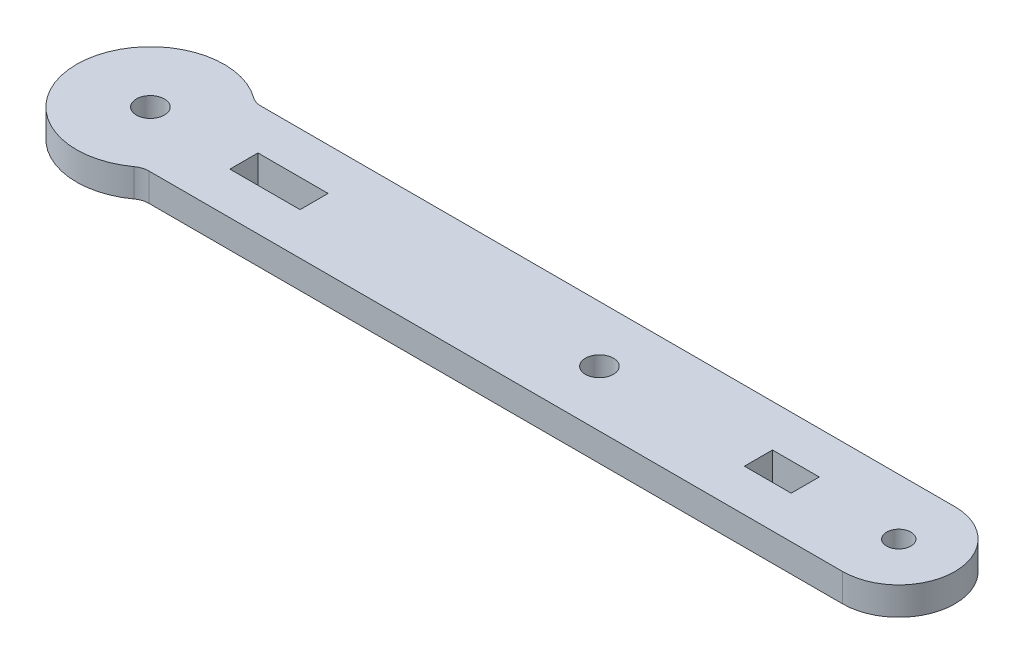
ISO-10303-21;
HEADER;
FILE_DESCRIPTION(('STEP AP214'),'2;1');
FILE_NAME('part.step','',(''),(''),'','','');
FILE_SCHEMA(('AUTOMOTIVE_DESIGN { 1 0 10303 214 1 1 1 1 }'));
ENDSEC;
DATA;
#1=APPLICATION_CONTEXT('core data for automotive mechanical design processes');
#2=APPLICATION_PROTOCOL_DEFINITION('international standard','automotive_design',2000,#1);
#3=PRODUCT_CONTEXT('',#1,'mechanical');
#4=PRODUCT('Part','Part','',(#3));
#5=PRODUCT_RELATED_PRODUCT_CATEGORY('part','',(#4));
#6=PRODUCT_DEFINITION_FORMATION('','',#4);
#7=PRODUCT_DEFINITION_CONTEXT('part definition',#1,'design');
#8=PRODUCT_DEFINITION('design','',#6,#7);
#9=PRODUCT_DEFINITION_SHAPE('','',#8);
#10=(LENGTH_UNIT() NAMED_UNIT(*) SI_UNIT(.MILLI.,.METRE.));
#11=(NAMED_UNIT(*) PLANE_ANGLE_UNIT() SI_UNIT($,.RADIAN.));
#12=(NAMED_UNIT(*) SI_UNIT($,.STERADIAN.) SOLID_ANGLE_UNIT());
#13=UNCERTAINTY_MEASURE_WITH_UNIT(LENGTH_MEASURE(1.E-05),#10,'distance_accuracy_value','');
#14=(GEOMETRIC_REPRESENTATION_CONTEXT(3) GLOBAL_UNCERTAINTY_ASSIGNED_CONTEXT((#13)) GLOBAL_UNIT_ASSIGNED_CONTEXT((#10,
#11,#12)) REPRESENTATION_CONTEXT('',''));
#15=CARTESIAN_POINT('',(0.,0.,0.));
#16=DIRECTION('',(0.,0.,1.));
#17=DIRECTION('',(1.,0.,0.));
#18=AXIS2_PLACEMENT_3D('',#15,#16,#17);
#19=CARTESIAN_POINT('',(0.,3.,0.));
#20=DIRECTION('',(0.,1.,0.));
#21=DIRECTION('',(0.,0.,1.));
#22=AXIS2_PLACEMENT_3D('',#19,#20,#21);
#23=PLANE('',#22);
#24=CARTESIAN_POINT('',(80.,3.,0.));
#25=DIRECTION('',(0.,1.,0.));
#26=DIRECTION('',(0.,0.,1.));
#27=AXIS2_PLACEMENT_3D('',#24,#25,#26);
#28=CIRCLE('',#27,1.3);
#29=CARTESIAN_POINT('',(80.,3.,1.3));
#30=VERTEX_POINT('',#29);
#31=EDGE_CURVE('E466',#30,#30,#28,.T.);
#32=ORIENTED_EDGE('',*,*,#31,.F.);
#33=EDGE_LOOP('',(#32));
#34=FACE_BOUND('',#33,.T.);
#35=CARTESIAN_POINT('',(0.,3.,0.));
#36=DIRECTION('',(0.,1.,0.));
#37=DIRECTION('',(0.,0.,1.));
#38=AXIS2_PLACEMENT_3D('',#35,#36,#37);
#39=CIRCLE('',#38,1.49999999999999);
#40=CARTESIAN_POINT('',(0.,3.,1.49999999999999));
#41=VERTEX_POINT('',#40);
#42=EDGE_CURVE('E468',#41,#41,#39,.T.);
#43=ORIENTED_EDGE('',*,*,#42,.F.);
#44=EDGE_LOOP('',(#43));
#45=FACE_BOUND('',#44,.T.);
#46=CARTESIAN_POINT('',(48.,3.,0.));
#47=DIRECTION('',(0.,1.,0.));
#48=DIRECTION('',(0.,0.,1.));
#49=AXIS2_PLACEMENT_3D('',#46,#47,#48);
#50=CIRCLE('',#49,1.49999999999999);
#51=CARTESIAN_POINT('',(48.,3.,1.49999999999999));
#52=VERTEX_POINT('',#51);
#53=EDGE_CURVE('E476',#52,#52,#50,.T.);
#54=ORIENTED_EDGE('',*,*,#53,.F.);
#55=EDGE_LOOP('',(#54));
#56=FACE_BOUND('',#55,.T.);
#57=CARTESIAN_POINT('',(80.,3.,0.));
#58=DIRECTION('',(0.,1.,0.));
#59=DIRECTION('',(0.,0.,1.));
#60=AXIS2_PLACEMENT_3D('',#57,#58,#59);
#61=CIRCLE('',#60,6.);
#62=CARTESIAN_POINT('',(80.,3.,6.));
#63=VERTEX_POINT('',#62);
#64=CARTESIAN_POINT('',(80.,3.,-6.));
#65=VERTEX_POINT('',#64);
#66=EDGE_CURVE('E208',#63,#65,#61,.T.);
#67=ORIENTED_EDGE('',*,*,#66,.T.);
#68=DIRECTION('',(-1.,0.,0.));
#69=VECTOR('',#68,1.);
#70=CARTESIAN_POINT('',(0.,3.,-6.));
#71=LINE('',#70,#69);
#72=CARTESIAN_POINT('',(5.83180932472933,3.,-6.));
#73=VERTEX_POINT('',#72);
#74=EDGE_CURVE('E211',#65,#73,#71,.T.);
#75=ORIENTED_EDGE('',*,*,#74,.T.);
#76=CARTESIAN_POINT('',(5.83180932472933,3.,-8.));
#77=DIRECTION('',(0.,1.,0.));
#78=DIRECTION('',(0.,0.,1.));
#79=AXIS2_PLACEMENT_3D('',#76,#77,#78);
#80=CIRCLE('',#79,2.);
#81=CARTESIAN_POINT('',(4.65366602680421,3.,-6.38383838383839));
#82=VERTEX_POINT('',#81);
#83=EDGE_CURVE('E11',#73,#82,#80,.F.);
#84=ORIENTED_EDGE('',*,*,#83,.T.);
#85=CARTESIAN_POINT('',(0.,3.,0.));
#86=DIRECTION('',(0.,1.,0.));
#87=DIRECTION('',(0.,0.,1.));
#88=AXIS2_PLACEMENT_3D('',#85,#86,#87);
#89=CIRCLE('',#88,7.9);
#90=CARTESIAN_POINT('',(4.65366602680421,3.,6.38383838383839));
#91=VERTEX_POINT('',#90);
#92=EDGE_CURVE('E214',#82,#91,#89,.T.);
#93=ORIENTED_EDGE('',*,*,#92,.T.);
#94=CARTESIAN_POINT('',(5.83180932472933,3.,8.));
#95=DIRECTION('',(0.,1.,0.));
#96=DIRECTION('',(0.,0.,1.));
#97=AXIS2_PLACEMENT_3D('',#94,#95,#96);
#98=CIRCLE('',#97,2.);
#99=CARTESIAN_POINT('',(5.83180932472933,3.,6.));
#100=VERTEX_POINT('',#99);
#101=EDGE_CURVE('E245',#91,#100,#98,.F.);
#102=ORIENTED_EDGE('',*,*,#101,.T.);
#103=DIRECTION('',(-1.,0.,0.));
#104=VECTOR('',#103,1.);
#105=CARTESIAN_POINT('',(0.,3.,6.));
#106=LINE('',#105,#104);
#107=EDGE_CURVE('E217',#63,#100,#106,.T.);
#108=ORIENTED_EDGE('',*,*,#107,.F.);
#109=EDGE_LOOP('',(#67,#75,#84,#93,#102,#108));
#110=FACE_BOUND('',#109,.T.);
#111=DIRECTION('',(-1.,0.,0.));
#112=VECTOR('',#111,1.);
#113=CARTESIAN_POINT('',(10.,3.,-1.5));
#114=LINE('',#113,#112);
#115=CARTESIAN_POINT('',(17.5,3.,-1.5));
#116=VERTEX_POINT('',#115);
#117=CARTESIAN_POINT('',(10.,3.,-1.5));
#118=VERTEX_POINT('',#117);
#119=EDGE_CURVE('E179',#116,#118,#114,.T.);
#120=ORIENTED_EDGE('',*,*,#119,.F.);
#121=DIRECTION('',(0.,0.,-1.));
#122=VECTOR('',#121,1.);
#123=CARTESIAN_POINT('',(17.5,3.,1.5));
#124=LINE('',#123,#122);
#125=CARTESIAN_POINT('',(17.5,3.,1.5));
#126=VERTEX_POINT('',#125);
#127=EDGE_CURVE('E177',#126,#116,#124,.T.);
#128=ORIENTED_EDGE('',*,*,#127,.F.);
#129=DIRECTION('',(1.,0.,0.));
#130=VECTOR('',#129,1.);
#131=CARTESIAN_POINT('',(10.,3.,1.5));
#132=LINE('',#131,#130);
#133=CARTESIAN_POINT('',(10.,3.,1.5));
#134=VERTEX_POINT('',#133);
#135=EDGE_CURVE('E185',#134,#126,#132,.T.);
#136=ORIENTED_EDGE('',*,*,#135,.F.);
#137=DIRECTION('',(0.,0.,1.));
#138=VECTOR('',#137,1.);
#139=CARTESIAN_POINT('',(10.,3.,1.5));
#140=LINE('',#139,#138);
#141=EDGE_CURVE('E182',#118,#134,#140,.T.);
#142=ORIENTED_EDGE('',*,*,#141,.F.);
#143=EDGE_LOOP('',(#120,#128,#136,#142));
#144=FACE_BOUND('',#143,.T.);
#145=DIRECTION('',(-1.,0.,0.));
#146=VECTOR('',#145,1.);
#147=CARTESIAN_POINT('',(65.,3.,-1.5));
#148=LINE('',#147,#146);
#149=CARTESIAN_POINT('',(70.,3.,-1.5));
#150=VERTEX_POINT('',#149);
#151=CARTESIAN_POINT('',(65.,3.,-1.5));
#152=VERTEX_POINT('',#151);
#153=EDGE_CURVE('E144',#150,#152,#148,.T.);
#154=ORIENTED_EDGE('',*,*,#153,.F.);
#155=DIRECTION('',(0.,0.,-1.));
#156=VECTOR('',#155,1.);
#157=CARTESIAN_POINT('',(70.,3.,1.5));
#158=LINE('',#157,#156);
#159=CARTESIAN_POINT('',(70.,3.,1.5));
#160=VERTEX_POINT('',#159);
#161=EDGE_CURVE('E134',#160,#150,#158,.T.);
#162=ORIENTED_EDGE('',*,*,#161,.F.);
#163=DIRECTION('',(1.,0.,0.));
#164=VECTOR('',#163,1.);
#165=CARTESIAN_POINT('',(65.,3.,1.5));
#166=LINE('',#165,#164);
#167=CARTESIAN_POINT('',(65.,3.,1.5));
#168=VERTEX_POINT('',#167);
#169=EDGE_CURVE('E159',#168,#160,#166,.T.);
#170=ORIENTED_EDGE('',*,*,#169,.F.);
#171=DIRECTION('',(0.,0.,1.));
#172=VECTOR('',#171,1.);
#173=CARTESIAN_POINT('',(65.,3.,1.5));
#174=LINE('',#173,#172);
#175=EDGE_CURVE('E157',#152,#168,#174,.T.);
#176=ORIENTED_EDGE('',*,*,#175,.F.);
#177=EDGE_LOOP('',(#154,#162,#170,#176));
#178=FACE_BOUND('',#177,.T.);
#179=ADVANCED_FACE('F34',(#34,#45,#56,#110,#144,#178),#23,.T.);
#180=CARTESIAN_POINT('',(0.,0.,0.));
#181=DIRECTION('',(0.,1.,0.));
#182=DIRECTION('',(0.,0.,1.));
#183=AXIS2_PLACEMENT_3D('',#180,#181,#182);
#184=PLANE('',#183);
#185=CARTESIAN_POINT('',(80.,0.,0.));
#186=DIRECTION('',(0.,1.,0.));
#187=DIRECTION('',(0.,0.,1.));
#188=AXIS2_PLACEMENT_3D('',#185,#186,#187);
#189=CIRCLE('',#188,1.3);
#190=CARTESIAN_POINT('',(80.,0.,1.3));
#191=VERTEX_POINT('',#190);
#192=EDGE_CURVE('E464',#191,#191,#189,.T.);
#193=ORIENTED_EDGE('',*,*,#192,.T.);
#194=EDGE_LOOP('',(#193));
#195=FACE_BOUND('',#194,.T.);
#196=CARTESIAN_POINT('',(0.,0.,0.));
#197=DIRECTION('',(0.,1.,0.));
#198=DIRECTION('',(0.,0.,1.));
#199=AXIS2_PLACEMENT_3D('',#196,#197,#198);
#200=CIRCLE('',#199,1.5);
#201=CARTESIAN_POINT('',(0.,0.,1.5));
#202=VERTEX_POINT('',#201);
#203=EDGE_CURVE('E473',#202,#202,#200,.T.);
#204=ORIENTED_EDGE('',*,*,#203,.T.);
#205=EDGE_LOOP('',(#204));
#206=FACE_BOUND('',#205,.T.);
#207=CARTESIAN_POINT('',(48.,0.,0.));
#208=DIRECTION('',(0.,1.,0.));
#209=DIRECTION('',(0.,0.,1.));
#210=AXIS2_PLACEMENT_3D('',#207,#208,#209);
#211=CIRCLE('',#210,1.5);
#212=CARTESIAN_POINT('',(48.,0.,1.5));
#213=VERTEX_POINT('',#212);
#214=EDGE_CURVE('E192',#213,#213,#211,.T.);
#215=ORIENTED_EDGE('',*,*,#214,.T.);
#216=EDGE_LOOP('',(#215));
#217=FACE_BOUND('',#216,.T.);
#218=DIRECTION('',(0.,0.,-1.));
#219=VECTOR('',#218,1.);
#220=CARTESIAN_POINT('',(17.5,0.,1.5));
#221=LINE('',#220,#219);
#222=CARTESIAN_POINT('',(17.5,0.,1.5));
#223=VERTEX_POINT('',#222);
#224=CARTESIAN_POINT('',(17.5,0.,-1.5));
#225=VERTEX_POINT('',#224);
#226=EDGE_CURVE('E188',#223,#225,#221,.T.);
#227=ORIENTED_EDGE('',*,*,#226,.T.);
#228=DIRECTION('',(-1.,0.,0.));
#229=VECTOR('',#228,1.);
#230=CARTESIAN_POINT('',(10.,0.,-1.5));
#231=LINE('',#230,#229);
#232=CARTESIAN_POINT('',(10.,0.,-1.5));
#233=VERTEX_POINT('',#232);
#234=EDGE_CURVE('E191',#225,#233,#231,.T.);
#235=ORIENTED_EDGE('',*,*,#234,.T.);
#236=DIRECTION('',(0.,0.,1.));
#237=VECTOR('',#236,1.);
#238=CARTESIAN_POINT('',(10.,0.,1.5));
#239=LINE('',#238,#237);
#240=CARTESIAN_POINT('',(10.,0.,1.5));
#241=VERTEX_POINT('',#240);
#242=EDGE_CURVE('E195',#233,#241,#239,.T.);
#243=ORIENTED_EDGE('',*,*,#242,.T.);
#244=DIRECTION('',(1.,0.,0.));
#245=VECTOR('',#244,1.);
#246=CARTESIAN_POINT('',(10.,0.,1.5));
#247=LINE('',#246,#245);
#248=EDGE_CURVE('E180',#241,#223,#247,.T.);
#249=ORIENTED_EDGE('',*,*,#248,.T.);
#250=EDGE_LOOP('',(#227,#235,#243,#249));
#251=FACE_BOUND('',#250,.T.);
#252=CARTESIAN_POINT('',(80.,0.,0.));
#253=DIRECTION('',(0.,1.,0.));
#254=DIRECTION('',(0.,0.,1.));
#255=AXIS2_PLACEMENT_3D('',#252,#253,#254);
#256=CIRCLE('',#255,6.);
#257=CARTESIAN_POINT('',(80.,0.,6.));
#258=VERTEX_POINT('',#257);
#259=CARTESIAN_POINT('',(80.,0.,-6.));
#260=VERTEX_POINT('',#259);
#261=EDGE_CURVE('E152',#258,#260,#256,.T.);
#262=ORIENTED_EDGE('',*,*,#261,.F.);
#263=DIRECTION('',(-1.,0.,0.));
#264=VECTOR('',#263,1.);
#265=CARTESIAN_POINT('',(0.,0.,6.));
#266=LINE('',#265,#264);
#267=CARTESIAN_POINT('',(5.83180932472933,0.,6.));
#268=VERTEX_POINT('',#267);
#269=EDGE_CURVE('E212',#258,#268,#266,.T.);
#270=ORIENTED_EDGE('',*,*,#269,.T.);
#271=CARTESIAN_POINT('',(5.83180932472933,0.,8.));
#272=DIRECTION('',(0.,1.,0.));
#273=DIRECTION('',(0.,0.,1.));
#274=AXIS2_PLACEMENT_3D('',#271,#272,#273);
#275=CIRCLE('',#274,2.);
#276=CARTESIAN_POINT('',(4.65366602680421,0.,6.38383838383839));
#277=VERTEX_POINT('',#276);
#278=EDGE_CURVE('E243',#268,#277,#275,.T.);
#279=ORIENTED_EDGE('',*,*,#278,.T.);
#280=CARTESIAN_POINT('',(0.,0.,0.));
#281=DIRECTION('',(0.,1.,0.));
#282=DIRECTION('',(0.,0.,1.));
#283=AXIS2_PLACEMENT_3D('',#280,#281,#282);
#284=CIRCLE('',#283,7.9);
#285=CARTESIAN_POINT('',(4.65366602680421,0.,-6.38383838383839));
#286=VERTEX_POINT('',#285);
#287=EDGE_CURVE('E225',#286,#277,#284,.T.);
#288=ORIENTED_EDGE('',*,*,#287,.F.);
#289=CARTESIAN_POINT('',(5.83180932472933,0.,-8.));
#290=DIRECTION('',(0.,1.,0.));
#291=DIRECTION('',(0.,0.,1.));
#292=AXIS2_PLACEMENT_3D('',#289,#290,#291);
#293=CIRCLE('',#292,2.);
#294=CARTESIAN_POINT('',(5.83180932472933,0.,-6.));
#295=VERTEX_POINT('',#294);
#296=EDGE_CURVE('E42',#286,#295,#293,.T.);
#297=ORIENTED_EDGE('',*,*,#296,.T.);
#298=DIRECTION('',(-1.,0.,0.));
#299=VECTOR('',#298,1.);
#300=CARTESIAN_POINT('',(0.,0.,-6.));
#301=LINE('',#300,#299);
#302=EDGE_CURVE('E223',#260,#295,#301,.T.);
#303=ORIENTED_EDGE('',*,*,#302,.F.);
#304=EDGE_LOOP('',(#262,#270,#279,#288,#297,#303));
#305=FACE_BOUND('',#304,.T.);
#306=DIRECTION('',(0.,0.,-1.));
#307=VECTOR('',#306,1.);
#308=CARTESIAN_POINT('',(70.,0.,1.5));
#309=LINE('',#308,#307);
#310=CARTESIAN_POINT('',(70.,0.,1.5));
#311=VERTEX_POINT('',#310);
#312=CARTESIAN_POINT('',(70.,0.,-1.5));
#313=VERTEX_POINT('',#312);
#314=EDGE_CURVE('E164',#311,#313,#309,.T.);
#315=ORIENTED_EDGE('',*,*,#314,.T.);
#316=DIRECTION('',(-1.,0.,0.));
#317=VECTOR('',#316,1.);
#318=CARTESIAN_POINT('',(65.,0.,-1.5));
#319=LINE('',#318,#317);
#320=CARTESIAN_POINT('',(65.,0.,-1.5));
#321=VERTEX_POINT('',#320);
#322=EDGE_CURVE('E151',#313,#321,#319,.T.);
#323=ORIENTED_EDGE('',*,*,#322,.T.);
#324=DIRECTION('',(0.,0.,1.));
#325=VECTOR('',#324,1.);
#326=CARTESIAN_POINT('',(65.,0.,1.5));
#327=LINE('',#326,#325);
#328=CARTESIAN_POINT('',(65.,0.,1.5));
#329=VERTEX_POINT('',#328);
#330=EDGE_CURVE('E168',#321,#329,#327,.T.);
#331=ORIENTED_EDGE('',*,*,#330,.T.);
#332=DIRECTION('',(1.,0.,0.));
#333=VECTOR('',#332,1.);
#334=CARTESIAN_POINT('',(65.,0.,1.5));
#335=LINE('',#334,#333);
#336=EDGE_CURVE('E145',#329,#311,#335,.T.);
#337=ORIENTED_EDGE('',*,*,#336,.T.);
#338=EDGE_LOOP('',(#315,#323,#331,#337));
#339=FACE_BOUND('',#338,.T.);
#340=ADVANCED_FACE('F260',(#195,#206,#217,#251,#305,#339),#184,.F.);
#341=CARTESIAN_POINT('',(80.,3.,0.));
#342=DIRECTION('',(0.,-1.,0.));
#343=DIRECTION('',(0.,0.,-1.));
#344=AXIS2_PLACEMENT_3D('',#341,#342,#343);
#345=CYLINDRICAL_SURFACE('',#344,6.);
#346=ORIENTED_EDGE('',*,*,#261,.T.);
#347=DIRECTION('',(0.,-1.,0.));
#348=VECTOR('',#347,1.);
#349=CARTESIAN_POINT('',(80.,3.,-6.));
#350=LINE('',#349,#348);
#351=EDGE_CURVE('E231',#65,#260,#350,.T.);
#352=ORIENTED_EDGE('',*,*,#351,.F.);
#353=ORIENTED_EDGE('',*,*,#66,.F.);
#354=DIRECTION('',(0.,-1.,0.));
#355=VECTOR('',#354,1.);
#356=CARTESIAN_POINT('',(80.,3.,6.));
#357=LINE('',#356,#355);
#358=EDGE_CURVE('E220',#63,#258,#357,.T.);
#359=ORIENTED_EDGE('',*,*,#358,.T.);
#360=EDGE_LOOP('',(#346,#352,#353,#359));
#361=FACE_BOUND('',#360,.T.);
#362=ADVANCED_FACE('F270',(#361),#345,.T.);
#363=CARTESIAN_POINT('',(0.,3.,-6.));
#364=DIRECTION('',(0.,0.,1.));
#365=DIRECTION('',(1.,0.,0.));
#366=AXIS2_PLACEMENT_3D('',#363,#364,#365);
#367=PLANE('',#366);
#368=ORIENTED_EDGE('',*,*,#302,.T.);
#369=DIRECTION('',(0.,1.,0.));
#370=VECTOR('',#369,1.);
#371=CARTESIAN_POINT('',(5.83180932472933,3.,-6.));
#372=LINE('',#371,#370);
#373=EDGE_CURVE('E49',#295,#73,#372,.T.);
#374=ORIENTED_EDGE('',*,*,#373,.T.);
#375=ORIENTED_EDGE('',*,*,#74,.F.);
#376=ORIENTED_EDGE('',*,*,#351,.T.);
#377=EDGE_LOOP('',(#368,#374,#375,#376));
#378=FACE_BOUND('',#377,.T.);
#379=ADVANCED_FACE('F268',(#378),#367,.F.);
#380=CARTESIAN_POINT('',(0.,3.,0.));
#381=DIRECTION('',(0.,-1.,0.));
#382=DIRECTION('',(0.,0.,-1.));
#383=AXIS2_PLACEMENT_3D('',#380,#381,#382);
#384=CYLINDRICAL_SURFACE('',#383,7.9);
#385=ORIENTED_EDGE('',*,*,#287,.T.);
#386=DIRECTION('',(0.,-1.,0.));
#387=VECTOR('',#386,1.);
#388=CARTESIAN_POINT('',(4.65366602680421,3.,6.38383838383839));
#389=LINE('',#388,#387);
#390=EDGE_CURVE('E240',#277,#91,#389,.F.);
#391=ORIENTED_EDGE('',*,*,#390,.T.);
#392=ORIENTED_EDGE('',*,*,#92,.F.);
#393=DIRECTION('',(0.,-1.,0.));
#394=VECTOR('',#393,1.);
#395=CARTESIAN_POINT('',(4.65366602680421,3.,-6.38383838383839));
#396=LINE('',#395,#394);
#397=EDGE_CURVE('E237',#82,#286,#396,.T.);
#398=ORIENTED_EDGE('',*,*,#397,.T.);
#399=EDGE_LOOP('',(#385,#391,#392,#398));
#400=FACE_BOUND('',#399,.T.);
#401=ADVANCED_FACE('F263',(#400),#384,.T.);
#402=CARTESIAN_POINT('',(0.,3.,6.));
#403=DIRECTION('',(0.,0.,1.));
#404=DIRECTION('',(1.,0.,0.));
#405=AXIS2_PLACEMENT_3D('',#402,#403,#404);
#406=PLANE('',#405);
#407=ORIENTED_EDGE('',*,*,#107,.T.);
#408=DIRECTION('',(0.,-1.,0.));
#409=VECTOR('',#408,1.);
#410=CARTESIAN_POINT('',(5.83180932472933,3.,6.));
#411=LINE('',#410,#409);
#412=EDGE_CURVE('E234',#100,#268,#411,.T.);
#413=ORIENTED_EDGE('',*,*,#412,.T.);
#414=ORIENTED_EDGE('',*,*,#269,.F.);
#415=ORIENTED_EDGE('',*,*,#358,.F.);
#416=EDGE_LOOP('',(#407,#413,#414,#415));
#417=FACE_BOUND('',#416,.T.);
#418=ADVANCED_FACE('F255',(#417),#406,.T.);
#419=CARTESIAN_POINT('',(17.5,3.,1.5));
#420=DIRECTION('',(-1.,0.,0.));
#421=DIRECTION('',(0.,0.,1.));
#422=AXIS2_PLACEMENT_3D('',#419,#420,#421);
#423=PLANE('',#422);
#424=ORIENTED_EDGE('',*,*,#226,.F.);
#425=DIRECTION('',(0.,-1.,0.));
#426=VECTOR('',#425,1.);
#427=CARTESIAN_POINT('',(17.5,3.,1.5));
#428=LINE('',#427,#426);
#429=EDGE_CURVE('E187',#126,#223,#428,.T.);
#430=ORIENTED_EDGE('',*,*,#429,.F.);
#431=ORIENTED_EDGE('',*,*,#127,.T.);
#432=DIRECTION('',(0.,-1.,0.));
#433=VECTOR('',#432,1.);
#434=CARTESIAN_POINT('',(17.5,3.,-1.5));
#435=LINE('',#434,#433);
#436=EDGE_CURVE('E166',#116,#225,#435,.T.);
#437=ORIENTED_EDGE('',*,*,#436,.T.);
#438=EDGE_LOOP('',(#424,#430,#431,#437));
#439=FACE_BOUND('',#438,.T.);
#440=ADVANCED_FACE('F288',(#439),#423,.T.);
#441=CARTESIAN_POINT('',(10.,3.,-1.5));
#442=DIRECTION('',(0.,0.,1.));
#443=DIRECTION('',(1.,0.,0.));
#444=AXIS2_PLACEMENT_3D('',#441,#442,#443);
#445=PLANE('',#444);
#446=ORIENTED_EDGE('',*,*,#234,.F.);
#447=ORIENTED_EDGE('',*,*,#436,.F.);
#448=ORIENTED_EDGE('',*,*,#119,.T.);
#449=DIRECTION('',(0.,-1.,0.));
#450=VECTOR('',#449,1.);
#451=CARTESIAN_POINT('',(10.,3.,-1.5));
#452=LINE('',#451,#450);
#453=EDGE_CURVE('E204',#118,#233,#452,.T.);
#454=ORIENTED_EDGE('',*,*,#453,.T.);
#455=EDGE_LOOP('',(#446,#447,#448,#454));
#456=FACE_BOUND('',#455,.T.);
#457=ADVANCED_FACE('F309',(#456),#445,.T.);
#458=CARTESIAN_POINT('',(10.,3.,1.5));
#459=DIRECTION('',(1.,0.,0.));
#460=DIRECTION('',(0.,0.,-1.));
#461=AXIS2_PLACEMENT_3D('',#458,#459,#460);
#462=PLANE('',#461);
#463=ORIENTED_EDGE('',*,*,#242,.F.);
#464=ORIENTED_EDGE('',*,*,#453,.F.);
#465=ORIENTED_EDGE('',*,*,#141,.T.);
#466=DIRECTION('',(0.,-1.,0.));
#467=VECTOR('',#466,1.);
#468=CARTESIAN_POINT('',(10.,3.,1.5));
#469=LINE('',#468,#467);
#470=EDGE_CURVE('E202',#134,#241,#469,.T.);
#471=ORIENTED_EDGE('',*,*,#470,.T.);
#472=EDGE_LOOP('',(#463,#464,#465,#471));
#473=FACE_BOUND('',#472,.T.);
#474=ADVANCED_FACE('F316',(#473),#462,.T.);
#475=CARTESIAN_POINT('',(10.,3.,1.5));
#476=DIRECTION('',(0.,0.,-1.));
#477=DIRECTION('',(-1.,0.,0.));
#478=AXIS2_PLACEMENT_3D('',#475,#476,#477);
#479=PLANE('',#478);
#480=ORIENTED_EDGE('',*,*,#248,.F.);
#481=ORIENTED_EDGE('',*,*,#470,.F.);
#482=ORIENTED_EDGE('',*,*,#135,.T.);
#483=ORIENTED_EDGE('',*,*,#429,.T.);
#484=EDGE_LOOP('',(#480,#481,#482,#483));
#485=FACE_BOUND('',#484,.T.);
#486=ADVANCED_FACE('F323',(#485),#479,.T.);
#487=CARTESIAN_POINT('',(70.,3.,1.5));
#488=DIRECTION('',(-1.,0.,0.));
#489=DIRECTION('',(0.,0.,1.));
#490=AXIS2_PLACEMENT_3D('',#487,#488,#489);
#491=PLANE('',#490);
#492=ORIENTED_EDGE('',*,*,#314,.F.);
#493=DIRECTION('',(0.,-1.,0.));
#494=VECTOR('',#493,1.);
#495=CARTESIAN_POINT('',(70.,3.,1.5));
#496=LINE('',#495,#494);
#497=EDGE_CURVE('E140',#160,#311,#496,.T.);
#498=ORIENTED_EDGE('',*,*,#497,.F.);
#499=ORIENTED_EDGE('',*,*,#161,.T.);
#500=DIRECTION('',(0.,-1.,0.));
#501=VECTOR('',#500,1.);
#502=CARTESIAN_POINT('',(70.,3.,-1.5));
#503=LINE('',#502,#501);
#504=EDGE_CURVE('E137',#150,#313,#503,.T.);
#505=ORIENTED_EDGE('',*,*,#504,.T.);
#506=EDGE_LOOP('',(#492,#498,#499,#505));
#507=FACE_BOUND('',#506,.T.);
#508=ADVANCED_FACE('F136',(#507),#491,.T.);
#509=CARTESIAN_POINT('',(65.,3.,-1.5));
#510=DIRECTION('',(0.,0.,1.));
#511=DIRECTION('',(1.,0.,0.));
#512=AXIS2_PLACEMENT_3D('',#509,#510,#511);
#513=PLANE('',#512);
#514=ORIENTED_EDGE('',*,*,#322,.F.);
#515=ORIENTED_EDGE('',*,*,#504,.F.);
#516=ORIENTED_EDGE('',*,*,#153,.T.);
#517=DIRECTION('',(0.,-1.,0.));
#518=VECTOR('',#517,1.);
#519=CARTESIAN_POINT('',(65.,3.,-1.5));
#520=LINE('',#519,#518);
#521=EDGE_CURVE('E153',#152,#321,#520,.T.);
#522=ORIENTED_EDGE('',*,*,#521,.T.);
#523=EDGE_LOOP('',(#514,#515,#516,#522));
#524=FACE_BOUND('',#523,.T.);
#525=ADVANCED_FACE('F148',(#524),#513,.T.);
#526=CARTESIAN_POINT('',(65.,3.,1.5));
#527=DIRECTION('',(1.,0.,0.));
#528=DIRECTION('',(0.,0.,-1.));
#529=AXIS2_PLACEMENT_3D('',#526,#527,#528);
#530=PLANE('',#529);
#531=ORIENTED_EDGE('',*,*,#330,.F.);
#532=ORIENTED_EDGE('',*,*,#521,.F.);
#533=ORIENTED_EDGE('',*,*,#175,.T.);
#534=DIRECTION('',(0.,-1.,0.));
#535=VECTOR('',#534,1.);
#536=CARTESIAN_POINT('',(65.,3.,1.5));
#537=LINE('',#536,#535);
#538=EDGE_CURVE('E174',#168,#329,#537,.T.);
#539=ORIENTED_EDGE('',*,*,#538,.T.);
#540=EDGE_LOOP('',(#531,#532,#533,#539));
#541=FACE_BOUND('',#540,.T.);
#542=ADVANCED_FACE('F344',(#541),#530,.T.);
#543=CARTESIAN_POINT('',(65.,3.,1.5));
#544=DIRECTION('',(0.,0.,-1.));
#545=DIRECTION('',(-1.,0.,0.));
#546=AXIS2_PLACEMENT_3D('',#543,#544,#545);
#547=PLANE('',#546);
#548=ORIENTED_EDGE('',*,*,#336,.F.);
#549=ORIENTED_EDGE('',*,*,#538,.F.);
#550=ORIENTED_EDGE('',*,*,#169,.T.);
#551=ORIENTED_EDGE('',*,*,#497,.T.);
#552=EDGE_LOOP('',(#548,#549,#550,#551));
#553=FACE_BOUND('',#552,.T.);
#554=ADVANCED_FACE('F351',(#553),#547,.T.);
#555=CARTESIAN_POINT('',(48.,3.,0.));
#556=DIRECTION('',(0.,1.,0.));
#557=DIRECTION('',(0.,0.,1.));
#558=AXIS2_PLACEMENT_3D('',#555,#556,#557);
#559=CYLINDRICAL_SURFACE('',#558,1.49999999999999);
#560=ORIENTED_EDGE('',*,*,#214,.F.);
#561=EDGE_LOOP('',(#560));
#562=FACE_BOUND('',#561,.T.);
#563=ORIENTED_EDGE('',*,*,#53,.T.);
#564=EDGE_LOOP('',(#563));
#565=FACE_BOUND('',#564,.T.);
#566=ADVANCED_FACE('F359',(#562,#565),#559,.F.);
#567=CARTESIAN_POINT('',(0.,3.,0.));
#568=DIRECTION('',(0.,1.,0.));
#569=DIRECTION('',(0.,0.,1.));
#570=AXIS2_PLACEMENT_3D('',#567,#568,#569);
#571=CYLINDRICAL_SURFACE('',#570,1.49999999999999);
#572=ORIENTED_EDGE('',*,*,#203,.F.);
#573=EDGE_LOOP('',(#572));
#574=FACE_BOUND('',#573,.T.);
#575=ORIENTED_EDGE('',*,*,#42,.T.);
#576=EDGE_LOOP('',(#575));
#577=FACE_BOUND('',#576,.T.);
#578=ADVANCED_FACE('F367',(#574,#577),#571,.F.);
#579=CARTESIAN_POINT('',(80.,3.,0.));
#580=DIRECTION('',(0.,1.,0.));
#581=DIRECTION('',(0.,0.,1.));
#582=AXIS2_PLACEMENT_3D('',#579,#580,#581);
#583=CYLINDRICAL_SURFACE('',#582,1.3);
#584=ORIENTED_EDGE('',*,*,#192,.F.);
#585=EDGE_LOOP('',(#584));
#586=FACE_BOUND('',#585,.T.);
#587=ORIENTED_EDGE('',*,*,#31,.T.);
#588=EDGE_LOOP('',(#587));
#589=FACE_BOUND('',#588,.T.);
#590=ADVANCED_FACE('F375',(#586,#589),#583,.F.);
#591=CARTESIAN_POINT('',(5.83180932472933,3.,8.));
#592=DIRECTION('',(0.,-1.,0.));
#593=DIRECTION('',(0.,0.,-1.));
#594=AXIS2_PLACEMENT_3D('',#591,#592,#593);
#595=CYLINDRICAL_SURFACE('',#594,2.);
#596=ORIENTED_EDGE('',*,*,#101,.F.);
#597=ORIENTED_EDGE('',*,*,#390,.F.);
#598=ORIENTED_EDGE('',*,*,#278,.F.);
#599=ORIENTED_EDGE('',*,*,#412,.F.);
#600=EDGE_LOOP('',(#596,#597,#598,#599));
#601=FACE_BOUND('',#600,.T.);
#602=ADVANCED_FACE('F258',(#601),#595,.F.);
#603=CARTESIAN_POINT('',(5.83180932472933,3.,-8.));
#604=DIRECTION('',(0.,-1.,0.));
#605=DIRECTION('',(0.,0.,-1.));
#606=AXIS2_PLACEMENT_3D('',#603,#604,#605);
#607=CYLINDRICAL_SURFACE('',#606,2.);
#608=ORIENTED_EDGE('',*,*,#83,.F.);
#609=ORIENTED_EDGE('',*,*,#373,.F.);
#610=ORIENTED_EDGE('',*,*,#296,.F.);
#611=ORIENTED_EDGE('',*,*,#397,.F.);
#612=EDGE_LOOP('',(#608,#609,#610,#611));
#613=FACE_BOUND('',#612,.T.);
#614=ADVANCED_FACE('F36',(#613),#607,.F.);
#615=CLOSED_SHELL('',(#179,#340,#362,#379,#401,#418,#440,#457,#474,#486,#508,#525,#542,#554,
#566,#578,#590,#602,#614));
#616=MANIFOLD_SOLID_BREP('B2',#615);
#617=ADVANCED_BREP_SHAPE_REPRESENTATION('',(#18,#616),#14);
#618=SHAPE_DEFINITION_REPRESENTATION(#9,#617);
ENDSEC;
END-ISO-10303-21;
